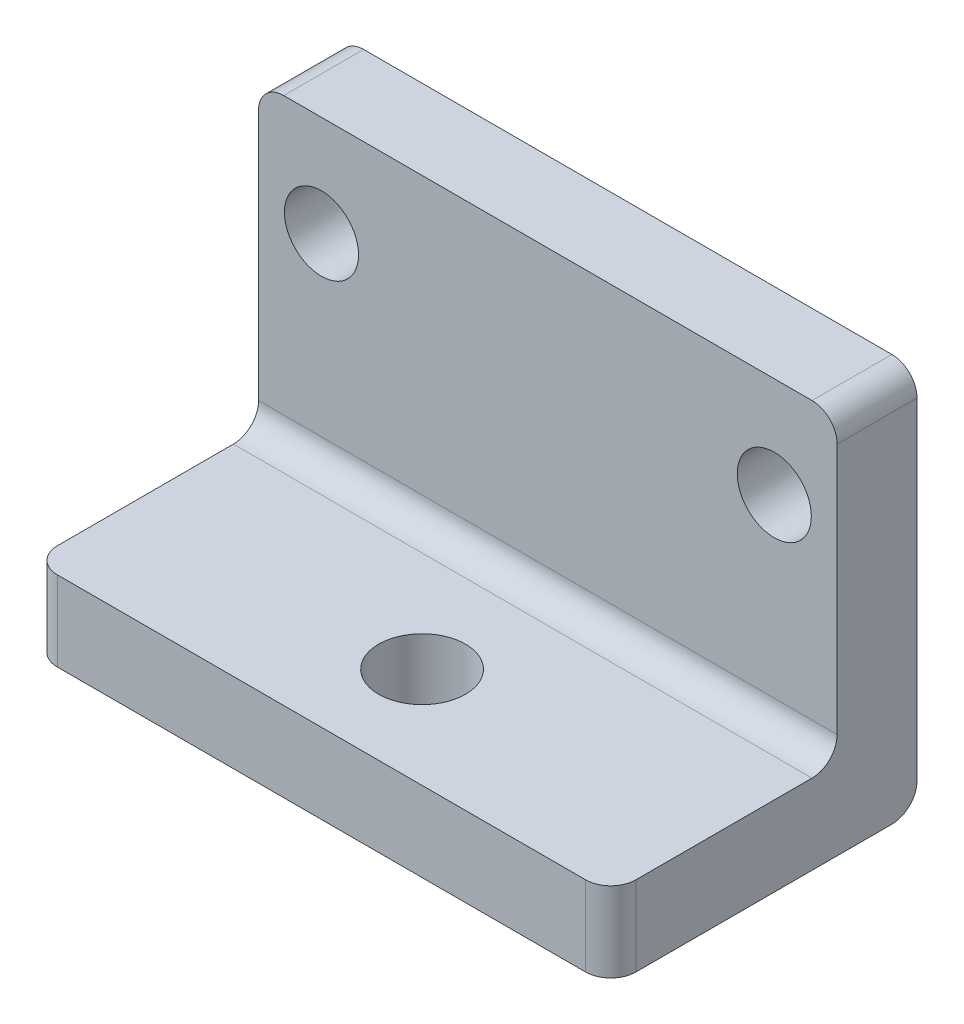
ISO-10303-21;
HEADER;
FILE_DESCRIPTION(('STEP AP214'),'2;1');
FILE_NAME('part.step','',(''),(''),'','','');
FILE_SCHEMA(('AUTOMOTIVE_DESIGN { 1 0 10303 214 1 1 1 1 }'));
ENDSEC;
DATA;
#1=APPLICATION_CONTEXT('core data for automotive mechanical design processes');
#2=APPLICATION_PROTOCOL_DEFINITION('international standard','automotive_design',2000,#1);
#3=PRODUCT_CONTEXT('',#1,'mechanical');
#4=PRODUCT('Part','Part','',(#3));
#5=PRODUCT_RELATED_PRODUCT_CATEGORY('part','',(#4));
#6=PRODUCT_DEFINITION_FORMATION('','',#4);
#7=PRODUCT_DEFINITION_CONTEXT('part definition',#1,'design');
#8=PRODUCT_DEFINITION('design','',#6,#7);
#9=PRODUCT_DEFINITION_SHAPE('','',#8);
#10=(LENGTH_UNIT() NAMED_UNIT(*) SI_UNIT(.MILLI.,.METRE.));
#11=(NAMED_UNIT(*) PLANE_ANGLE_UNIT() SI_UNIT($,.RADIAN.));
#12=(NAMED_UNIT(*) SI_UNIT($,.STERADIAN.) SOLID_ANGLE_UNIT());
#13=UNCERTAINTY_MEASURE_WITH_UNIT(LENGTH_MEASURE(1.E-05),#10,'distance_accuracy_value','');
#14=(GEOMETRIC_REPRESENTATION_CONTEXT(3) GLOBAL_UNCERTAINTY_ASSIGNED_CONTEXT((#13)) GLOBAL_UNIT_ASSIGNED_CONTEXT((#10,
#11,#12)) REPRESENTATION_CONTEXT('',''));
#15=CARTESIAN_POINT('',(0.,0.,0.));
#16=DIRECTION('',(0.,0.,1.));
#17=DIRECTION('',(1.,0.,0.));
#18=AXIS2_PLACEMENT_3D('',#15,#16,#17);
#19=CARTESIAN_POINT('',(23.,0.,3.175));
#20=DIRECTION('',(1.,0.,0.));
#21=DIRECTION('',(0.,0.,-1.));
#22=AXIS2_PLACEMENT_3D('',#19,#20,#21);
#23=PLANE('',#22);
#24=DIRECTION('',(0.,-1.,0.));
#25=VECTOR('',#24,1.);
#26=CARTESIAN_POINT('',(23.,0.,0.));
#27=LINE('',#26,#25);
#28=CARTESIAN_POINT('',(23.,1.,0.));
#29=VERTEX_POINT('',#28);
#30=CARTESIAN_POINT('',(23.,-12.175,0.));
#31=VERTEX_POINT('',#30);
#32=EDGE_CURVE('E163',#29,#31,#27,.T.);
#33=ORIENTED_EDGE('',*,*,#32,.F.);
#34=DIRECTION('',(0.,0.,-1.));
#35=VECTOR('',#34,1.);
#36=CARTESIAN_POINT('',(23.,1.,3.175));
#37=LINE('',#36,#35);
#38=CARTESIAN_POINT('',(23.,1.,3.175));
#39=VERTEX_POINT('',#38);
#40=EDGE_CURVE('E189',#29,#39,#37,.F.);
#41=ORIENTED_EDGE('',*,*,#40,.T.);
#42=DIRECTION('',(0.,-1.,0.));
#43=VECTOR('',#42,1.);
#44=CARTESIAN_POINT('',(23.,0.,3.175));
#45=LINE('',#44,#43);
#46=CARTESIAN_POINT('',(23.,-9.,3.175));
#47=VERTEX_POINT('',#46);
#48=EDGE_CURVE('E262',#39,#47,#45,.T.);
#49=ORIENTED_EDGE('',*,*,#48,.T.);
#50=CARTESIAN_POINT('',(23.,-9.,4.175));
#51=DIRECTION('',(1.,0.,0.));
#52=DIRECTION('',(0.,0.,-1.));
#53=AXIS2_PLACEMENT_3D('',#50,#51,#52);
#54=CIRCLE('',#53,1.);
#55=CARTESIAN_POINT('',(23.,-10.,4.175));
#56=VERTEX_POINT('',#55);
#57=EDGE_CURVE('E11',#47,#56,#54,.F.);
#58=ORIENTED_EDGE('',*,*,#57,.T.);
#59=DIRECTION('',(0.,0.,-1.));
#60=VECTOR('',#59,1.);
#61=CARTESIAN_POINT('',(23.,-10.,12.175));
#62=LINE('',#61,#60);
#63=CARTESIAN_POINT('',(23.,-10.,11.175));
#64=VERTEX_POINT('',#63);
#65=EDGE_CURVE('E260',#64,#56,#62,.T.);
#66=ORIENTED_EDGE('',*,*,#65,.F.);
#67=DIRECTION('',(0.,1.,0.));
#68=VECTOR('',#67,1.);
#69=CARTESIAN_POINT('',(23.,0.,11.175));
#70=LINE('',#69,#68);
#71=CARTESIAN_POINT('',(23.,-13.175,11.175));
#72=VERTEX_POINT('',#71);
#73=EDGE_CURVE('E186',#64,#72,#70,.F.);
#74=ORIENTED_EDGE('',*,*,#73,.T.);
#75=DIRECTION('',(0.,0.,-1.));
#76=VECTOR('',#75,1.);
#77=CARTESIAN_POINT('',(23.,-13.175,3.175));
#78=LINE('',#77,#76);
#79=CARTESIAN_POINT('',(23.,-13.175,1.));
#80=VERTEX_POINT('',#79);
#81=EDGE_CURVE('E175',#72,#80,#78,.T.);
#82=ORIENTED_EDGE('',*,*,#81,.T.);
#83=CARTESIAN_POINT('',(23.,-12.175,1.));
#84=DIRECTION('',(1.,0.,0.));
#85=DIRECTION('',(0.,0.,-1.));
#86=AXIS2_PLACEMENT_3D('',#83,#84,#85);
#87=CIRCLE('',#86,1.);
#88=EDGE_CURVE('E183',#80,#31,#87,.T.);
#89=ORIENTED_EDGE('',*,*,#88,.T.);
#90=EDGE_LOOP('',(#33,#41,#49,#58,#66,#74,#82,#89));
#91=FACE_BOUND('',#90,.T.);
#92=ADVANCED_FACE('F49',(#91),#23,.T.);
#93=CARTESIAN_POINT('',(0.,2.,3.175));
#94=DIRECTION('',(0.,1.,0.));
#95=DIRECTION('',(0.,0.,1.));
#96=AXIS2_PLACEMENT_3D('',#93,#94,#95);
#97=PLANE('',#96);
#98=DIRECTION('',(1.,0.,0.));
#99=VECTOR('',#98,1.);
#100=CARTESIAN_POINT('',(0.,2.,3.175));
#101=LINE('',#100,#99);
#102=CARTESIAN_POINT('',(1.,2.,3.175));
#103=VERTEX_POINT('',#102);
#104=CARTESIAN_POINT('',(22.,2.,3.175));
#105=VERTEX_POINT('',#104);
#106=EDGE_CURVE('E252',#103,#105,#101,.T.);
#107=ORIENTED_EDGE('',*,*,#106,.T.);
#108=DIRECTION('',(0.,0.,-1.));
#109=VECTOR('',#108,1.);
#110=CARTESIAN_POINT('',(22.,2.,3.175));
#111=LINE('',#110,#109);
#112=CARTESIAN_POINT('',(22.,2.,0.));
#113=VERTEX_POINT('',#112);
#114=EDGE_CURVE('E161',#105,#113,#111,.T.);
#115=ORIENTED_EDGE('',*,*,#114,.T.);
#116=DIRECTION('',(1.,0.,0.));
#117=VECTOR('',#116,1.);
#118=CARTESIAN_POINT('',(0.,2.,0.));
#119=LINE('',#118,#117);
#120=CARTESIAN_POINT('',(1.,2.,0.));
#121=VERTEX_POINT('',#120);
#122=EDGE_CURVE('E143',#121,#113,#119,.T.);
#123=ORIENTED_EDGE('',*,*,#122,.F.);
#124=DIRECTION('',(0.,0.,-1.));
#125=VECTOR('',#124,1.);
#126=CARTESIAN_POINT('',(1.,2.,3.175));
#127=LINE('',#126,#125);
#128=EDGE_CURVE('E158',#121,#103,#127,.F.);
#129=ORIENTED_EDGE('',*,*,#128,.T.);
#130=EDGE_LOOP('',(#107,#115,#123,#129));
#131=FACE_BOUND('',#130,.T.);
#132=ADVANCED_FACE('F157',(#131),#97,.T.);
#133=CARTESIAN_POINT('',(0.,0.,3.175));
#134=DIRECTION('',(1.,0.,0.));
#135=DIRECTION('',(0.,1.,0.));
#136=AXIS2_PLACEMENT_3D('',#133,#134,#135);
#137=PLANE('',#136);
#138=DIRECTION('',(0.,-1.,0.));
#139=VECTOR('',#138,1.);
#140=CARTESIAN_POINT('',(0.,0.,3.175));
#141=LINE('',#140,#139);
#142=CARTESIAN_POINT('',(0.,1.,3.175));
#143=VERTEX_POINT('',#142);
#144=CARTESIAN_POINT('',(0.,-9.,3.175));
#145=VERTEX_POINT('',#144);
#146=EDGE_CURVE('E240',#143,#145,#141,.T.);
#147=ORIENTED_EDGE('',*,*,#146,.F.);
#148=DIRECTION('',(0.,0.,-1.));
#149=VECTOR('',#148,1.);
#150=CARTESIAN_POINT('',(0.,1.,0.));
#151=LINE('',#150,#149);
#152=CARTESIAN_POINT('',(0.,1.,0.));
#153=VERTEX_POINT('',#152);
#154=EDGE_CURVE('E207',#143,#153,#151,.T.);
#155=ORIENTED_EDGE('',*,*,#154,.T.);
#156=DIRECTION('',(0.,-1.,0.));
#157=VECTOR('',#156,1.);
#158=CARTESIAN_POINT('',(0.,0.,0.));
#159=LINE('',#158,#157);
#160=CARTESIAN_POINT('',(0.,-12.175,0.));
#161=VERTEX_POINT('',#160);
#162=EDGE_CURVE('E145',#153,#161,#159,.T.);
#163=ORIENTED_EDGE('',*,*,#162,.T.);
#164=CARTESIAN_POINT('',(0.,-12.175,1.));
#165=DIRECTION('',(1.,0.,0.));
#166=DIRECTION('',(0.,1.,0.));
#167=AXIS2_PLACEMENT_3D('',#164,#165,#166);
#168=CIRCLE('',#167,1.);
#169=CARTESIAN_POINT('',(0.,-13.175,1.));
#170=VERTEX_POINT('',#169);
#171=EDGE_CURVE('E200',#161,#170,#168,.F.);
#172=ORIENTED_EDGE('',*,*,#171,.T.);
#173=DIRECTION('',(0.,0.,-1.));
#174=VECTOR('',#173,1.);
#175=CARTESIAN_POINT('',(0.,-13.175,3.175));
#176=LINE('',#175,#174);
#177=CARTESIAN_POINT('',(0.,-13.175,11.175));
#178=VERTEX_POINT('',#177);
#179=EDGE_CURVE('E169',#178,#170,#176,.T.);
#180=ORIENTED_EDGE('',*,*,#179,.F.);
#181=DIRECTION('',(0.,1.,0.));
#182=VECTOR('',#181,1.);
#183=CARTESIAN_POINT('',(0.,-10.,11.175));
#184=LINE('',#183,#182);
#185=CARTESIAN_POINT('',(0.,-10.,11.175));
#186=VERTEX_POINT('',#185);
#187=EDGE_CURVE('E203',#178,#186,#184,.T.);
#188=ORIENTED_EDGE('',*,*,#187,.T.);
#189=DIRECTION('',(0.,0.,-1.));
#190=VECTOR('',#189,1.);
#191=CARTESIAN_POINT('',(0.,-10.,12.175));
#192=LINE('',#191,#190);
#193=CARTESIAN_POINT('',(0.,-10.,4.175));
#194=VERTEX_POINT('',#193);
#195=EDGE_CURVE('E242',#186,#194,#192,.T.);
#196=ORIENTED_EDGE('',*,*,#195,.T.);
#197=CARTESIAN_POINT('',(0.,-9.,4.175));
#198=DIRECTION('',(1.,0.,0.));
#199=DIRECTION('',(0.,1.,0.));
#200=AXIS2_PLACEMENT_3D('',#197,#198,#199);
#201=CIRCLE('',#200,1.);
#202=EDGE_CURVE('E58',#194,#145,#201,.T.);
#203=ORIENTED_EDGE('',*,*,#202,.T.);
#204=EDGE_LOOP('',(#147,#155,#163,#172,#180,#188,#196,#203));
#205=FACE_BOUND('',#204,.T.);
#206=ADVANCED_FACE('F239',(#205),#137,.F.);
#207=CARTESIAN_POINT('',(2.5,-2.,3.175));
#208=DIRECTION('',(0.,0.,-1.));
#209=DIRECTION('',(-1.,0.,0.));
#210=AXIS2_PLACEMENT_3D('',#207,#208,#209);
#211=CYLINDRICAL_SURFACE('',#210,1.4732);
#212=CARTESIAN_POINT('',(2.5,-2.,3.175));
#213=DIRECTION('',(0.,0.,1.));
#214=DIRECTION('',(1.,0.,0.));
#215=AXIS2_PLACEMENT_3D('',#212,#213,#214);
#216=CIRCLE('',#215,1.4732);
#217=CARTESIAN_POINT('',(3.9732,-2.,3.175));
#218=VERTEX_POINT('',#217);
#219=EDGE_CURVE('E283',#218,#218,#216,.T.);
#220=ORIENTED_EDGE('',*,*,#219,.T.);
#221=EDGE_LOOP('',(#220));
#222=FACE_BOUND('',#221,.T.);
#223=CARTESIAN_POINT('',(2.5,-2.,0.));
#224=DIRECTION('',(0.,0.,1.));
#225=DIRECTION('',(1.,0.,0.));
#226=AXIS2_PLACEMENT_3D('',#223,#224,#225);
#227=CIRCLE('',#226,1.4732);
#228=CARTESIAN_POINT('',(3.9732,-2.,0.));
#229=VERTEX_POINT('',#228);
#230=EDGE_CURVE('E272',#229,#229,#227,.T.);
#231=ORIENTED_EDGE('',*,*,#230,.F.);
#232=EDGE_LOOP('',(#231));
#233=FACE_BOUND('',#232,.T.);
#234=ADVANCED_FACE('F339',(#222,#233),#211,.F.);
#235=CARTESIAN_POINT('',(20.5,-2.,3.175));
#236=DIRECTION('',(0.,0.,-1.));
#237=DIRECTION('',(-1.,0.,0.));
#238=AXIS2_PLACEMENT_3D('',#235,#236,#237);
#239=CYLINDRICAL_SURFACE('',#238,1.4732);
#240=CARTESIAN_POINT('',(20.5,-2.,3.175));
#241=DIRECTION('',(0.,0.,1.));
#242=DIRECTION('',(1.,0.,0.));
#243=AXIS2_PLACEMENT_3D('',#240,#241,#242);
#244=CIRCLE('',#243,1.4732);
#245=CARTESIAN_POINT('',(21.9732,-2.,3.175));
#246=VERTEX_POINT('',#245);
#247=EDGE_CURVE('E279',#246,#246,#244,.T.);
#248=ORIENTED_EDGE('',*,*,#247,.T.);
#249=EDGE_LOOP('',(#248));
#250=FACE_BOUND('',#249,.T.);
#251=CARTESIAN_POINT('',(20.5,-2.,0.));
#252=DIRECTION('',(0.,0.,1.));
#253=DIRECTION('',(1.,0.,0.));
#254=AXIS2_PLACEMENT_3D('',#251,#252,#253);
#255=CIRCLE('',#254,1.4732);
#256=CARTESIAN_POINT('',(21.9732,-2.,0.));
#257=VERTEX_POINT('',#256);
#258=EDGE_CURVE('E267',#257,#257,#255,.T.);
#259=ORIENTED_EDGE('',*,*,#258,.F.);
#260=EDGE_LOOP('',(#259));
#261=FACE_BOUND('',#260,.T.);
#262=ADVANCED_FACE('F342',(#250,#261),#239,.F.);
#263=CARTESIAN_POINT('',(0.,-13.175,3.175));
#264=DIRECTION('',(0.,1.,0.));
#265=DIRECTION('',(0.,0.,1.));
#266=AXIS2_PLACEMENT_3D('',#263,#264,#265);
#267=PLANE('',#266);
#268=CARTESIAN_POINT('',(11.5,-13.175,8.175));
#269=DIRECTION('',(0.,1.,0.));
#270=DIRECTION('',(0.,0.,1.));
#271=AXIS2_PLACEMENT_3D('',#268,#269,#270);
#272=CIRCLE('',#271,1.7272);
#273=CARTESIAN_POINT('',(11.5,-13.175,9.9022));
#274=VERTEX_POINT('',#273);
#275=EDGE_CURVE('E308',#274,#274,#272,.T.);
#276=ORIENTED_EDGE('',*,*,#275,.T.);
#277=EDGE_LOOP('',(#276));
#278=FACE_BOUND('',#277,.T.);
#279=DIRECTION('',(-1.,0.,0.));
#280=VECTOR('',#279,1.);
#281=CARTESIAN_POINT('',(0.,-13.175,12.175));
#282=LINE('',#281,#280);
#283=CARTESIAN_POINT('',(22.,-13.175,12.175));
#284=VERTEX_POINT('',#283);
#285=CARTESIAN_POINT('',(1.,-13.175,12.175));
#286=VERTEX_POINT('',#285);
#287=EDGE_CURVE('E274',#284,#286,#282,.T.);
#288=ORIENTED_EDGE('',*,*,#287,.T.);
#289=CARTESIAN_POINT('',(1.,-13.175,11.175));
#290=DIRECTION('',(0.,1.,0.));
#291=DIRECTION('',(0.,0.,1.));
#292=AXIS2_PLACEMENT_3D('',#289,#290,#291);
#293=CIRCLE('',#292,1.);
#294=EDGE_CURVE('E232',#286,#178,#293,.F.);
#295=ORIENTED_EDGE('',*,*,#294,.T.);
#296=ORIENTED_EDGE('',*,*,#179,.T.);
#297=DIRECTION('',(1.,0.,0.));
#298=VECTOR('',#297,1.);
#299=CARTESIAN_POINT('',(0.,-13.175,1.));
#300=LINE('',#299,#298);
#301=EDGE_CURVE('E226',#170,#80,#300,.T.);
#302=ORIENTED_EDGE('',*,*,#301,.T.);
#303=ORIENTED_EDGE('',*,*,#81,.F.);
#304=CARTESIAN_POINT('',(22.,-13.175,11.175));
#305=DIRECTION('',(0.,1.,0.));
#306=DIRECTION('',(0.,0.,1.));
#307=AXIS2_PLACEMENT_3D('',#304,#305,#306);
#308=CIRCLE('',#307,1.);
#309=EDGE_CURVE('E72',#72,#284,#308,.F.);
#310=ORIENTED_EDGE('',*,*,#309,.T.);
#311=EDGE_LOOP('',(#288,#295,#296,#302,#303,#310));
#312=FACE_BOUND('',#311,.T.);
#313=ADVANCED_FACE('F300',(#278,#312),#267,.F.);
#314=CARTESIAN_POINT('',(0.,0.,3.175));
#315=DIRECTION('',(0.,0.,1.));
#316=DIRECTION('',(1.,0.,0.));
#317=AXIS2_PLACEMENT_3D('',#314,#315,#316);
#318=PLANE('',#317);
#319=ORIENTED_EDGE('',*,*,#48,.F.);
#320=CARTESIAN_POINT('',(22.,1.,3.175));
#321=DIRECTION('',(0.,0.,1.));
#322=DIRECTION('',(1.,0.,0.));
#323=AXIS2_PLACEMENT_3D('',#320,#321,#322);
#324=CIRCLE('',#323,1.);
#325=EDGE_CURVE('E197',#39,#105,#324,.T.);
#326=ORIENTED_EDGE('',*,*,#325,.T.);
#327=ORIENTED_EDGE('',*,*,#106,.F.);
#328=CARTESIAN_POINT('',(1.,1.,3.175));
#329=DIRECTION('',(0.,0.,1.));
#330=DIRECTION('',(1.,0.,0.));
#331=AXIS2_PLACEMENT_3D('',#328,#329,#330);
#332=CIRCLE('',#331,1.);
#333=EDGE_CURVE('E167',#103,#143,#332,.T.);
#334=ORIENTED_EDGE('',*,*,#333,.T.);
#335=ORIENTED_EDGE('',*,*,#146,.T.);
#336=DIRECTION('',(-1.,0.,0.));
#337=VECTOR('',#336,1.);
#338=CARTESIAN_POINT('',(0.,-9.,3.175));
#339=LINE('',#338,#337);
#340=EDGE_CURVE('E192',#145,#47,#339,.F.);
#341=ORIENTED_EDGE('',*,*,#340,.T.);
#342=EDGE_LOOP('',(#319,#326,#327,#334,#335,#341));
#343=FACE_BOUND('',#342,.T.);
#344=ORIENTED_EDGE('',*,*,#247,.F.);
#345=EDGE_LOOP('',(#344));
#346=FACE_BOUND('',#345,.T.);
#347=ORIENTED_EDGE('',*,*,#219,.F.);
#348=EDGE_LOOP('',(#347));
#349=FACE_BOUND('',#348,.T.);
#350=ADVANCED_FACE('F248',(#343,#346,#349),#318,.T.);
#351=CARTESIAN_POINT('',(0.,0.,0.));
#352=DIRECTION('',(0.,0.,1.));
#353=DIRECTION('',(1.,0.,0.));
#354=AXIS2_PLACEMENT_3D('',#351,#352,#353);
#355=PLANE('',#354);
#356=ORIENTED_EDGE('',*,*,#258,.T.);
#357=EDGE_LOOP('',(#356));
#358=FACE_BOUND('',#357,.T.);
#359=ORIENTED_EDGE('',*,*,#230,.T.);
#360=EDGE_LOOP('',(#359));
#361=FACE_BOUND('',#360,.T.);
#362=ORIENTED_EDGE('',*,*,#122,.T.);
#363=CARTESIAN_POINT('',(22.,1.,0.));
#364=DIRECTION('',(0.,0.,1.));
#365=DIRECTION('',(1.,0.,0.));
#366=AXIS2_PLACEMENT_3D('',#363,#364,#365);
#367=CIRCLE('',#366,1.);
#368=EDGE_CURVE('E151',#113,#29,#367,.F.);
#369=ORIENTED_EDGE('',*,*,#368,.T.);
#370=ORIENTED_EDGE('',*,*,#32,.T.);
#371=DIRECTION('',(1.,0.,0.));
#372=VECTOR('',#371,1.);
#373=CARTESIAN_POINT('',(0.,-12.175,0.));
#374=LINE('',#373,#372);
#375=EDGE_CURVE('E152',#31,#161,#374,.F.);
#376=ORIENTED_EDGE('',*,*,#375,.T.);
#377=ORIENTED_EDGE('',*,*,#162,.F.);
#378=CARTESIAN_POINT('',(1.,1.,0.));
#379=DIRECTION('',(0.,0.,1.));
#380=DIRECTION('',(1.,0.,0.));
#381=AXIS2_PLACEMENT_3D('',#378,#379,#380);
#382=CIRCLE('',#381,1.);
#383=EDGE_CURVE('E140',#153,#121,#382,.F.);
#384=ORIENTED_EDGE('',*,*,#383,.T.);
#385=EDGE_LOOP('',(#362,#369,#370,#376,#377,#384));
#386=FACE_BOUND('',#385,.T.);
#387=ADVANCED_FACE('F142',(#358,#361,#386),#355,.F.);
#388=CARTESIAN_POINT('',(0.,-10.,12.175));
#389=DIRECTION('',(0.,-1.,0.));
#390=DIRECTION('',(1.,0.,0.));
#391=AXIS2_PLACEMENT_3D('',#388,#389,#390);
#392=PLANE('',#391);
#393=CARTESIAN_POINT('',(11.5,-10.,8.175));
#394=DIRECTION('',(0.,1.,0.));
#395=DIRECTION('',(0.,0.,1.));
#396=AXIS2_PLACEMENT_3D('',#393,#394,#395);
#397=CIRCLE('',#396,1.7272);
#398=CARTESIAN_POINT('',(11.5,-10.,9.9022));
#399=VERTEX_POINT('',#398);
#400=EDGE_CURVE('E312',#399,#399,#397,.T.);
#401=ORIENTED_EDGE('',*,*,#400,.F.);
#402=EDGE_LOOP('',(#401));
#403=FACE_BOUND('',#402,.T.);
#404=ORIENTED_EDGE('',*,*,#65,.T.);
#405=DIRECTION('',(-1.,0.,0.));
#406=VECTOR('',#405,1.);
#407=CARTESIAN_POINT('',(0.,-10.,4.175));
#408=LINE('',#407,#406);
#409=EDGE_CURVE('E216',#56,#194,#408,.T.);
#410=ORIENTED_EDGE('',*,*,#409,.T.);
#411=ORIENTED_EDGE('',*,*,#195,.F.);
#412=CARTESIAN_POINT('',(1.,-10.,11.175));
#413=DIRECTION('',(0.,-1.,0.));
#414=DIRECTION('',(1.,0.,0.));
#415=AXIS2_PLACEMENT_3D('',#412,#413,#414);
#416=CIRCLE('',#415,1.);
#417=CARTESIAN_POINT('',(1.,-10.,12.175));
#418=VERTEX_POINT('',#417);
#419=EDGE_CURVE('E213',#186,#418,#416,.F.);
#420=ORIENTED_EDGE('',*,*,#419,.T.);
#421=DIRECTION('',(-1.,0.,0.));
#422=VECTOR('',#421,1.);
#423=CARTESIAN_POINT('',(0.,-10.,12.175));
#424=LINE('',#423,#422);
#425=CARTESIAN_POINT('',(22.,-10.,12.175));
#426=VERTEX_POINT('',#425);
#427=EDGE_CURVE('E306',#426,#418,#424,.T.);
#428=ORIENTED_EDGE('',*,*,#427,.F.);
#429=CARTESIAN_POINT('',(22.,-10.,11.175));
#430=DIRECTION('',(0.,-1.,0.));
#431=DIRECTION('',(1.,0.,0.));
#432=AXIS2_PLACEMENT_3D('',#429,#430,#431);
#433=CIRCLE('',#432,1.);
#434=EDGE_CURVE('E210',#426,#64,#433,.F.);
#435=ORIENTED_EDGE('',*,*,#434,.T.);
#436=EDGE_LOOP('',(#404,#410,#411,#420,#428,#435));
#437=FACE_BOUND('',#436,.T.);
#438=ADVANCED_FACE('F264',(#403,#437),#392,.F.);
#439=CARTESIAN_POINT('',(0.,0.,12.175));
#440=DIRECTION('',(0.,0.,1.));
#441=DIRECTION('',(1.,0.,0.));
#442=AXIS2_PLACEMENT_3D('',#439,#440,#441);
#443=PLANE('',#442);
#444=ORIENTED_EDGE('',*,*,#427,.T.);
#445=DIRECTION('',(0.,1.,0.));
#446=VECTOR('',#445,1.);
#447=CARTESIAN_POINT('',(1.,-13.175,12.175));
#448=LINE('',#447,#446);
#449=EDGE_CURVE('E65',#418,#286,#448,.F.);
#450=ORIENTED_EDGE('',*,*,#449,.T.);
#451=ORIENTED_EDGE('',*,*,#287,.F.);
#452=DIRECTION('',(0.,1.,0.));
#453=VECTOR('',#452,1.);
#454=CARTESIAN_POINT('',(22.,0.,12.175));
#455=LINE('',#454,#453);
#456=EDGE_CURVE('E220',#284,#426,#455,.T.);
#457=ORIENTED_EDGE('',*,*,#456,.T.);
#458=EDGE_LOOP('',(#444,#450,#451,#457));
#459=FACE_BOUND('',#458,.T.);
#460=ADVANCED_FACE('F305',(#459),#443,.T.);
#461=CARTESIAN_POINT('',(11.5,-10.,8.175));
#462=DIRECTION('',(0.,1.,0.));
#463=DIRECTION('',(0.,0.,1.));
#464=AXIS2_PLACEMENT_3D('',#461,#462,#463);
#465=CYLINDRICAL_SURFACE('',#464,1.7272);
#466=ORIENTED_EDGE('',*,*,#275,.F.);
#467=EDGE_LOOP('',(#466));
#468=FACE_BOUND('',#467,.T.);
#469=ORIENTED_EDGE('',*,*,#400,.T.);
#470=EDGE_LOOP('',(#469));
#471=FACE_BOUND('',#470,.T.);
#472=ADVANCED_FACE('F319',(#468,#471),#465,.F.);
#473=CARTESIAN_POINT('',(22.,1.,3.175));
#474=DIRECTION('',(0.,0.,-1.));
#475=DIRECTION('',(-1.,0.,0.));
#476=AXIS2_PLACEMENT_3D('',#473,#474,#475);
#477=CYLINDRICAL_SURFACE('',#476,1.);
#478=ORIENTED_EDGE('',*,*,#325,.F.);
#479=ORIENTED_EDGE('',*,*,#40,.F.);
#480=ORIENTED_EDGE('',*,*,#368,.F.);
#481=ORIENTED_EDGE('',*,*,#114,.F.);
#482=EDGE_LOOP('',(#478,#479,#480,#481));
#483=FACE_BOUND('',#482,.T.);
#484=ADVANCED_FACE('F347',(#483),#477,.T.);
#485=CARTESIAN_POINT('',(1.,1.,3.175));
#486=DIRECTION('',(0.,0.,1.));
#487=DIRECTION('',(1.,0.,0.));
#488=AXIS2_PLACEMENT_3D('',#485,#486,#487);
#489=CYLINDRICAL_SURFACE('',#488,1.);
#490=ORIENTED_EDGE('',*,*,#333,.F.);
#491=ORIENTED_EDGE('',*,*,#128,.F.);
#492=ORIENTED_EDGE('',*,*,#383,.F.);
#493=ORIENTED_EDGE('',*,*,#154,.F.);
#494=EDGE_LOOP('',(#490,#491,#492,#493));
#495=FACE_BOUND('',#494,.T.);
#496=ADVANCED_FACE('F166',(#495),#489,.T.);
#497=CARTESIAN_POINT('',(0.,-9.,4.175));
#498=DIRECTION('',(-1.,0.,0.));
#499=DIRECTION('',(0.,-1.,0.));
#500=AXIS2_PLACEMENT_3D('',#497,#498,#499);
#501=CYLINDRICAL_SURFACE('',#500,1.);
#502=ORIENTED_EDGE('',*,*,#57,.F.);
#503=ORIENTED_EDGE('',*,*,#340,.F.);
#504=ORIENTED_EDGE('',*,*,#202,.F.);
#505=ORIENTED_EDGE('',*,*,#409,.F.);
#506=EDGE_LOOP('',(#502,#503,#504,#505));
#507=FACE_BOUND('',#506,.T.);
#508=ADVANCED_FACE('F255',(#507),#501,.F.);
#509=CARTESIAN_POINT('',(1.,0.,11.175));
#510=DIRECTION('',(0.,-1.,0.));
#511=DIRECTION('',(1.,0.,0.));
#512=AXIS2_PLACEMENT_3D('',#509,#510,#511);
#513=CYLINDRICAL_SURFACE('',#512,1.);
#514=ORIENTED_EDGE('',*,*,#294,.F.);
#515=ORIENTED_EDGE('',*,*,#449,.F.);
#516=ORIENTED_EDGE('',*,*,#419,.F.);
#517=ORIENTED_EDGE('',*,*,#187,.F.);
#518=EDGE_LOOP('',(#514,#515,#516,#517));
#519=FACE_BOUND('',#518,.T.);
#520=ADVANCED_FACE('F355',(#519),#513,.T.);
#521=CARTESIAN_POINT('',(22.,0.,11.175));
#522=DIRECTION('',(0.,1.,0.));
#523=DIRECTION('',(0.,0.,1.));
#524=AXIS2_PLACEMENT_3D('',#521,#522,#523);
#525=CYLINDRICAL_SURFACE('',#524,1.);
#526=ORIENTED_EDGE('',*,*,#309,.F.);
#527=ORIENTED_EDGE('',*,*,#73,.F.);
#528=ORIENTED_EDGE('',*,*,#434,.F.);
#529=ORIENTED_EDGE('',*,*,#456,.F.);
#530=EDGE_LOOP('',(#526,#527,#528,#529));
#531=FACE_BOUND('',#530,.T.);
#532=ADVANCED_FACE('F304',(#531),#525,.T.);
#533=CARTESIAN_POINT('',(0.,-12.175,1.));
#534=DIRECTION('',(1.,0.,0.));
#535=DIRECTION('',(0.,0.,-1.));
#536=AXIS2_PLACEMENT_3D('',#533,#534,#535);
#537=CYLINDRICAL_SURFACE('',#536,1.);
#538=ORIENTED_EDGE('',*,*,#171,.F.);
#539=ORIENTED_EDGE('',*,*,#375,.F.);
#540=ORIENTED_EDGE('',*,*,#88,.F.);
#541=ORIENTED_EDGE('',*,*,#301,.F.);
#542=EDGE_LOOP('',(#538,#539,#540,#541));
#543=FACE_BOUND('',#542,.T.);
#544=ADVANCED_FACE('F51',(#543),#537,.T.);
#545=CLOSED_SHELL('',(#92,#132,#206,#234,#262,#313,#350,#387,#438,#460,#472,#484,#496,#508,#520,
#532,#544));
#546=MANIFOLD_SOLID_BREP('B2',#545);
#547=ADVANCED_BREP_SHAPE_REPRESENTATION('',(#18,#546),#14);
#548=SHAPE_DEFINITION_REPRESENTATION(#9,#547);
ENDSEC;
END-ISO-10303-21;
